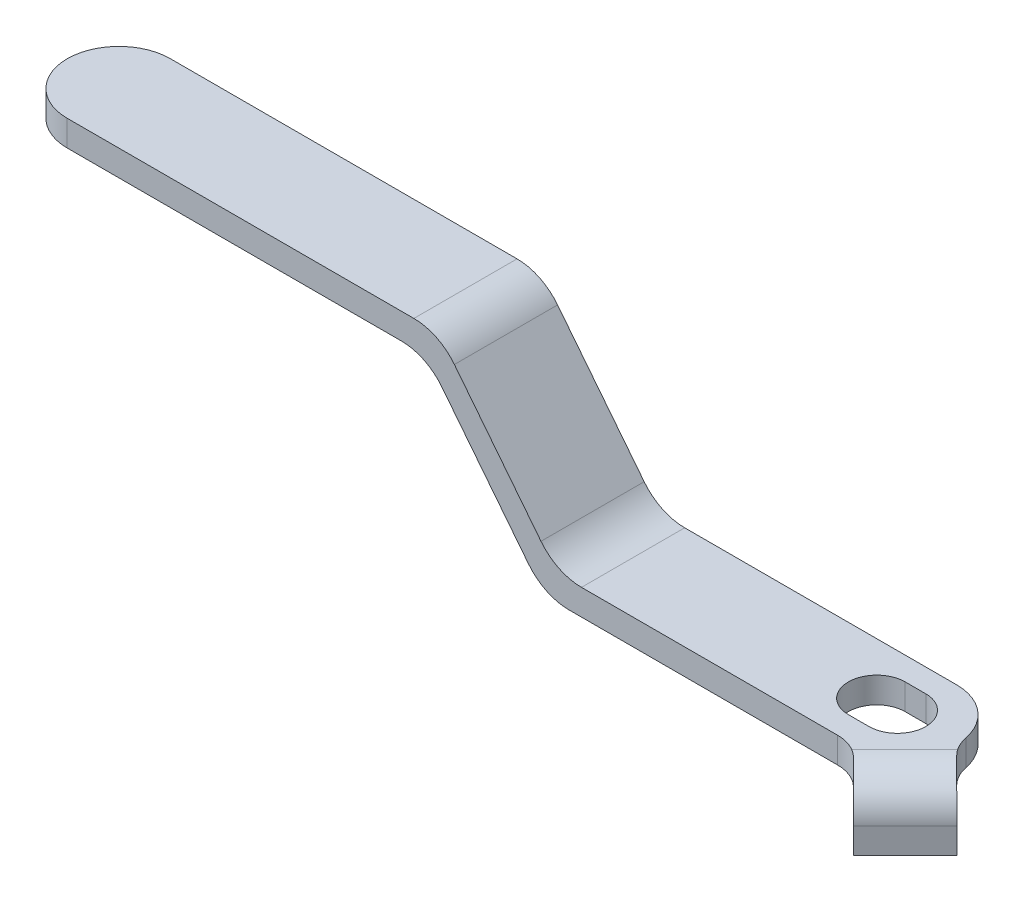
ISO-10303-21;
HEADER;
FILE_DESCRIPTION(('STEP AP214'),'2;1');
FILE_NAME('part.step','',(''),(''),'','','');
FILE_SCHEMA(('AUTOMOTIVE_DESIGN { 1 0 10303 214 1 1 1 1 }'));
ENDSEC;
DATA;
#1=APPLICATION_CONTEXT('core data for automotive mechanical design processes');
#2=APPLICATION_PROTOCOL_DEFINITION('international standard','automotive_design',2000,#1);
#3=PRODUCT_CONTEXT('',#1,'mechanical');
#4=PRODUCT('Part','Part','',(#3));
#5=PRODUCT_RELATED_PRODUCT_CATEGORY('part','',(#4));
#6=PRODUCT_DEFINITION_FORMATION('','',#4);
#7=PRODUCT_DEFINITION_CONTEXT('part definition',#1,'design');
#8=PRODUCT_DEFINITION('design','',#6,#7);
#9=PRODUCT_DEFINITION_SHAPE('','',#8);
#10=(LENGTH_UNIT() NAMED_UNIT(*) SI_UNIT(.MILLI.,.METRE.));
#11=(NAMED_UNIT(*) PLANE_ANGLE_UNIT() SI_UNIT($,.RADIAN.));
#12=(NAMED_UNIT(*) SI_UNIT($,.STERADIAN.) SOLID_ANGLE_UNIT());
#13=UNCERTAINTY_MEASURE_WITH_UNIT(LENGTH_MEASURE(1.E-05),#10,'distance_accuracy_value','');
#14=(GEOMETRIC_REPRESENTATION_CONTEXT(3) GLOBAL_UNCERTAINTY_ASSIGNED_CONTEXT((#13)) GLOBAL_UNIT_ASSIGNED_CONTEXT((#10,
#11,#12)) REPRESENTATION_CONTEXT('',''));
#15=CARTESIAN_POINT('',(0.,0.,0.));
#16=DIRECTION('',(0.,0.,1.));
#17=DIRECTION('',(1.,0.,0.));
#18=AXIS2_PLACEMENT_3D('',#15,#16,#17);
#19=CARTESIAN_POINT('',(0.,0.,10.));
#20=DIRECTION('',(0.,-1.,0.));
#21=DIRECTION('',(0.,0.,-1.));
#22=AXIS2_PLACEMENT_3D('',#19,#20,#21);
#23=PLANE('',#22);
#24=CARTESIAN_POINT('',(-15.4911035062388,0.,0.));
#25=DIRECTION('',(0.,1.,0.));
#26=DIRECTION('',(0.,0.,1.));
#27=AXIS2_PLACEMENT_3D('',#24,#25,#26);
#28=CIRCLE('',#27,5.5);
#29=CARTESIAN_POINT('',(-15.4911035062388,0.,-5.5));
#30=VERTEX_POINT('',#29);
#31=CARTESIAN_POINT('',(-15.4911035062388,0.,5.5));
#32=VERTEX_POINT('',#31);
#33=EDGE_CURVE('E248',#30,#32,#28,.T.);
#34=ORIENTED_EDGE('',*,*,#33,.T.);
#35=DIRECTION('',(1.,0.,0.));
#36=VECTOR('',#35,1.);
#37=CARTESIAN_POINT('',(-15.4911035062388,0.,5.5));
#38=LINE('',#37,#36);
#39=CARTESIAN_POINT('',(-11.4911035062388,0.,5.5));
#40=VERTEX_POINT('',#39);
#41=EDGE_CURVE('E251',#32,#40,#38,.T.);
#42=ORIENTED_EDGE('',*,*,#41,.T.);
#43=CARTESIAN_POINT('',(-11.4911035062388,0.,0.));
#44=DIRECTION('',(0.,1.,0.));
#45=DIRECTION('',(0.,0.,1.));
#46=AXIS2_PLACEMENT_3D('',#43,#44,#45);
#47=CIRCLE('',#46,5.5);
#48=CARTESIAN_POINT('',(-11.4911035062388,0.,-5.5));
#49=VERTEX_POINT('',#48);
#50=EDGE_CURVE('E255',#40,#49,#47,.T.);
#51=ORIENTED_EDGE('',*,*,#50,.T.);
#52=DIRECTION('',(-1.,0.,0.));
#53=VECTOR('',#52,1.);
#54=CARTESIAN_POINT('',(-15.4911035062388,0.,-5.5));
#55=LINE('',#54,#53);
#56=EDGE_CURVE('E258',#49,#30,#55,.T.);
#57=ORIENTED_EDGE('',*,*,#56,.T.);
#58=EDGE_LOOP('',(#34,#42,#51,#57));
#59=FACE_BOUND('',#58,.T.);
#60=CARTESIAN_POINT('',(7.15530501610128,0.,-3.45622768412761));
#61=DIRECTION('',(0.,-1.,0.));
#62=DIRECTION('',(0.,0.,-1.));
#63=AXIS2_PLACEMENT_3D('',#60,#61,#62);
#64=CIRCLE('',#63,7.5);
#65=CARTESIAN_POINT('',(-0.196968562227838,0.,-1.97498724807292));
#66=VERTEX_POINT('',#65);
#67=CARTESIAN_POINT('',(1.23971411701597,0.,1.15417189884337));
#68=VERTEX_POINT('',#67);
#69=EDGE_CURVE('E387',#66,#68,#64,.F.);
#70=ORIENTED_EDGE('',*,*,#69,.T.);
#71=DIRECTION('',(0.70616535591959,0.,-0.708046954727552));
#72=VECTOR('',#71,1.);
#73=CARTESIAN_POINT('',(-3.80139190576495,0.,6.2087101000847));
#74=LINE('',#73,#72);
#75=CARTESIAN_POINT('',(-8.88208900271876,0.,11.3029448671056));
#76=VERTEX_POINT('',#75);
#77=EDGE_CURVE('E454',#68,#76,#74,.F.);
#78=ORIENTED_EDGE('',*,*,#77,.T.);
#79=CARTESIAN_POINT('',(-13.1066017177981,0.,17.5));
#80=DIRECTION('',(0.,-1.,0.));
#81=DIRECTION('',(0.,0.,-1.));
#82=AXIS2_PLACEMENT_3D('',#79,#80,#81);
#83=CIRCLE('',#82,7.5);
#84=CARTESIAN_POINT('',(-13.1066017177981,0.,10.));
#85=VERTEX_POINT('',#84);
#86=EDGE_CURVE('E381',#76,#85,#83,.F.);
#87=ORIENTED_EDGE('',*,*,#86,.T.);
#88=DIRECTION('',(-1.,0.,0.));
#89=VECTOR('',#88,1.);
#90=CARTESIAN_POINT('',(0.,0.,10.));
#91=LINE('',#90,#89);
#92=CARTESIAN_POINT('',(-65.1506196064879,0.,10.));
#93=VERTEX_POINT('',#92);
#94=EDGE_CURVE('E290',#85,#93,#91,.T.);
#95=ORIENTED_EDGE('',*,*,#94,.T.);
#96=DIRECTION('',(0.,0.,-1.));
#97=VECTOR('',#96,1.);
#98=CARTESIAN_POINT('',(-65.1506196064879,0.,10.));
#99=LINE('',#98,#97);
#100=CARTESIAN_POINT('',(-65.1506196064879,0.,-10.));
#101=VERTEX_POINT('',#100);
#102=EDGE_CURVE('E297',#93,#101,#99,.T.);
#103=ORIENTED_EDGE('',*,*,#102,.T.);
#104=DIRECTION('',(-1.,0.,0.));
#105=VECTOR('',#104,1.);
#106=CARTESIAN_POINT('',(0.,0.,-10.));
#107=LINE('',#106,#105);
#108=CARTESIAN_POINT('',(-10.,0.,-10.));
#109=VERTEX_POINT('',#108);
#110=EDGE_CURVE('E307',#109,#101,#107,.T.);
#111=ORIENTED_EDGE('',*,*,#110,.F.);
#112=CARTESIAN_POINT('',(-10.,0.,0.));
#113=DIRECTION('',(0.,-1.,0.));
#114=DIRECTION('',(0.,0.,-1.));
#115=AXIS2_PLACEMENT_3D('',#112,#113,#114);
#116=CIRCLE('',#115,10.);
#117=EDGE_CURVE('E367',#109,#66,#116,.T.);
#118=ORIENTED_EDGE('',*,*,#117,.T.);
#119=EDGE_LOOP('',(#70,#78,#87,#95,#103,#111,#118));
#120=FACE_BOUND('',#119,.T.);
#121=ADVANCED_FACE('F41',(#59,#120),#23,.T.);
#122=CARTESIAN_POINT('',(-92.7912607189929,33.90126072,10.));
#123=DIRECTION('',(0.,-1.,0.));
#124=DIRECTION('',(1.,0.,0.));
#125=AXIS2_PLACEMENT_3D('',#122,#123,#124);
#126=PLANE('',#125);
#127=DIRECTION('',(-1.,0.,0.));
#128=VECTOR('',#127,1.);
#129=CARTESIAN_POINT('',(-92.7912607189929,33.90126072,-10.));
#130=LINE('',#129,#128);
#131=CARTESIAN_POINT('',(-95.215950915749,33.90126072,-10.));
#132=VERTEX_POINT('',#131);
#133=CARTESIAN_POINT('',(-162.41,33.90126072,-10.));
#134=VERTEX_POINT('',#133);
#135=EDGE_CURVE('E298',#132,#134,#130,.T.);
#136=ORIENTED_EDGE('',*,*,#135,.T.);
#137=CARTESIAN_POINT('',(-162.41,33.90126072,0.));
#138=DIRECTION('',(0.,-1.,0.));
#139=DIRECTION('',(1.,0.,0.));
#140=AXIS2_PLACEMENT_3D('',#137,#138,#139);
#141=CIRCLE('',#140,10.);
#142=CARTESIAN_POINT('',(-172.41,33.90126072,0.));
#143=VERTEX_POINT('',#142);
#144=EDGE_CURVE('E359',#134,#143,#141,.F.);
#145=ORIENTED_EDGE('',*,*,#144,.T.);
#146=CARTESIAN_POINT('',(-162.41,33.90126072,0.));
#147=DIRECTION('',(0.,-1.,0.));
#148=DIRECTION('',(1.,0.,0.));
#149=AXIS2_PLACEMENT_3D('',#146,#147,#148);
#150=CIRCLE('',#149,10.);
#151=CARTESIAN_POINT('',(-162.41,33.90126072,10.));
#152=VERTEX_POINT('',#151);
#153=EDGE_CURVE('E357',#143,#152,#150,.F.);
#154=ORIENTED_EDGE('',*,*,#153,.T.);
#155=DIRECTION('',(-1.,0.,0.));
#156=VECTOR('',#155,1.);
#157=CARTESIAN_POINT('',(-92.7912607189929,33.90126072,10.));
#158=LINE('',#157,#156);
#159=CARTESIAN_POINT('',(-95.215950915749,33.90126072,10.));
#160=VERTEX_POINT('',#159);
#161=EDGE_CURVE('E280',#160,#152,#158,.T.);
#162=ORIENTED_EDGE('',*,*,#161,.F.);
#163=DIRECTION('',(0.,0.,-1.));
#164=VECTOR('',#163,1.);
#165=CARTESIAN_POINT('',(-95.215950915749,33.90126072,10.));
#166=LINE('',#165,#164);
#167=EDGE_CURVE('E339',#160,#132,#166,.T.);
#168=ORIENTED_EDGE('',*,*,#167,.T.);
#169=EDGE_LOOP('',(#136,#145,#154,#162,#168));
#170=FACE_BOUND('',#169,.T.);
#171=ADVANCED_FACE('F504',(#170),#126,.F.);
#172=CARTESIAN_POINT('',(-92.7912607189929,28.90126072,10.));
#173=DIRECTION('',(0.,-1.,0.));
#174=DIRECTION('',(1.,0.,0.));
#175=AXIS2_PLACEMENT_3D('',#172,#173,#174);
#176=PLANE('',#175);
#177=CARTESIAN_POINT('',(-162.41,28.90126072,0.));
#178=DIRECTION('',(0.,-1.,0.));
#179=DIRECTION('',(1.,0.,0.));
#180=AXIS2_PLACEMENT_3D('',#177,#178,#179);
#181=CIRCLE('',#180,10.);
#182=CARTESIAN_POINT('',(-162.41,28.90126072,10.));
#183=VERTEX_POINT('',#182);
#184=CARTESIAN_POINT('',(-172.41,28.90126072,0.));
#185=VERTEX_POINT('',#184);
#186=EDGE_CURVE('E361',#183,#185,#181,.T.);
#187=ORIENTED_EDGE('',*,*,#186,.T.);
#188=CARTESIAN_POINT('',(-162.41,28.90126072,0.));
#189=DIRECTION('',(0.,-1.,0.));
#190=DIRECTION('',(1.,0.,0.));
#191=AXIS2_PLACEMENT_3D('',#188,#189,#190);
#192=CIRCLE('',#191,10.);
#193=CARTESIAN_POINT('',(-162.41,28.90126072,-10.));
#194=VERTEX_POINT('',#193);
#195=EDGE_CURVE('E363',#185,#194,#192,.T.);
#196=ORIENTED_EDGE('',*,*,#195,.T.);
#197=DIRECTION('',(-1.,0.,0.));
#198=VECTOR('',#197,1.);
#199=CARTESIAN_POINT('',(-92.7912607189929,28.90126072,-10.));
#200=LINE('',#199,#198);
#201=CARTESIAN_POINT('',(-97.6406411125051,28.90126072,-10.));
#202=VERTEX_POINT('',#201);
#203=EDGE_CURVE('E301',#202,#194,#200,.T.);
#204=ORIENTED_EDGE('',*,*,#203,.F.);
#205=DIRECTION('',(0.,0.,-1.));
#206=VECTOR('',#205,1.);
#207=CARTESIAN_POINT('',(-97.6406411125051,28.90126072,10.));
#208=LINE('',#207,#206);
#209=CARTESIAN_POINT('',(-97.6406411125051,28.90126072,10.));
#210=VERTEX_POINT('',#209);
#211=EDGE_CURVE('E337',#202,#210,#208,.F.);
#212=ORIENTED_EDGE('',*,*,#211,.T.);
#213=DIRECTION('',(-1.,0.,0.));
#214=VECTOR('',#213,1.);
#215=CARTESIAN_POINT('',(-92.7912607189929,28.90126072,10.));
#216=LINE('',#215,#214);
#217=EDGE_CURVE('E283',#210,#183,#216,.T.);
#218=ORIENTED_EDGE('',*,*,#217,.T.);
#219=EDGE_LOOP('',(#187,#196,#204,#212,#218));
#220=FACE_BOUND('',#219,.T.);
#221=ADVANCED_FACE('F495',(#220),#176,.T.);
#222=CARTESIAN_POINT('',(-70.,0.,10.));
#223=DIRECTION('',(-0.785219914461861,-0.619216994221338,0.));
#224=DIRECTION('',(0.619216994221338,-0.785219914461861,0.));
#225=AXIS2_PLACEMENT_3D('',#222,#223,#224);
#226=PLANE('',#225);
#227=DIRECTION('',(-0.619216994221338,0.785219914461861,0.));
#228=VECTOR('',#227,1.);
#229=CARTESIAN_POINT('',(-70.,0.,-10.));
#230=LINE('',#229,#228);
#231=CARTESIAN_POINT('',(-73.0028187511065,3.80783005778663,-10.));
#232=VERTEX_POINT('',#231);
#233=CARTESIAN_POINT('',(-89.7884419678865,25.0934306622134,-10.));
#234=VERTEX_POINT('',#233);
#235=EDGE_CURVE('E304',#232,#234,#230,.T.);
#236=ORIENTED_EDGE('',*,*,#235,.F.);
#237=DIRECTION('',(0.,0.,-1.));
#238=VECTOR('',#237,1.);
#239=CARTESIAN_POINT('',(-73.0028187511065,3.80783005778663,10.));
#240=LINE('',#239,#238);
#241=CARTESIAN_POINT('',(-73.0028187511065,3.80783005778663,10.));
#242=VERTEX_POINT('',#241);
#243=EDGE_CURVE('E322',#232,#242,#240,.F.);
#244=ORIENTED_EDGE('',*,*,#243,.T.);
#245=DIRECTION('',(-0.619216994221338,0.785219914461861,0.));
#246=VECTOR('',#245,1.);
#247=CARTESIAN_POINT('',(-70.,0.,10.));
#248=LINE('',#247,#246);
#249=CARTESIAN_POINT('',(-89.7884419678865,25.0934306622134,10.));
#250=VERTEX_POINT('',#249);
#251=EDGE_CURVE('E287',#242,#250,#248,.T.);
#252=ORIENTED_EDGE('',*,*,#251,.T.);
#253=DIRECTION('',(0.,0.,-1.));
#254=VECTOR('',#253,1.);
#255=CARTESIAN_POINT('',(-89.7884419678865,25.0934306622134,-10.));
#256=LINE('',#255,#254);
#257=EDGE_CURVE('E319',#250,#234,#256,.T.);
#258=ORIENTED_EDGE('',*,*,#257,.T.);
#259=EDGE_LOOP('',(#236,#244,#252,#258));
#260=FACE_BOUND('',#259,.T.);
#261=ADVANCED_FACE('F486',(#260),#226,.T.);
#262=CARTESIAN_POINT('',(0.,5.,10.));
#263=DIRECTION('',(0.,-1.,0.));
#264=DIRECTION('',(0.,0.,-1.));
#265=AXIS2_PLACEMENT_3D('',#262,#263,#264);
#266=PLANE('',#265);
#267=DIRECTION('',(1.,0.,0.));
#268=VECTOR('',#267,1.);
#269=CARTESIAN_POINT('',(-15.4911035062388,5.,5.5));
#270=LINE('',#269,#268);
#271=CARTESIAN_POINT('',(-15.4911035062388,5.,5.5));
#272=VERTEX_POINT('',#271);
#273=CARTESIAN_POINT('',(-11.4911035062388,5.,5.5));
#274=VERTEX_POINT('',#273);
#275=EDGE_CURVE('E263',#272,#274,#270,.T.);
#276=ORIENTED_EDGE('',*,*,#275,.F.);
#277=CARTESIAN_POINT('',(-15.4911035062388,5.,0.));
#278=DIRECTION('',(0.,1.,0.));
#279=DIRECTION('',(0.,0.,1.));
#280=AXIS2_PLACEMENT_3D('',#277,#278,#279);
#281=CIRCLE('',#280,5.5);
#282=CARTESIAN_POINT('',(-15.4911035062388,5.,-5.5));
#283=VERTEX_POINT('',#282);
#284=EDGE_CURVE('E246',#283,#272,#281,.T.);
#285=ORIENTED_EDGE('',*,*,#284,.F.);
#286=DIRECTION('',(-1.,0.,0.));
#287=VECTOR('',#286,1.);
#288=CARTESIAN_POINT('',(-15.4911035062388,5.,-5.5));
#289=LINE('',#288,#287);
#290=CARTESIAN_POINT('',(-11.4911035062388,5.,-5.5));
#291=VERTEX_POINT('',#290);
#292=EDGE_CURVE('E252',#291,#283,#289,.T.);
#293=ORIENTED_EDGE('',*,*,#292,.F.);
#294=CARTESIAN_POINT('',(-11.4911035062388,5.,0.));
#295=DIRECTION('',(0.,1.,0.));
#296=DIRECTION('',(0.,0.,1.));
#297=AXIS2_PLACEMENT_3D('',#294,#295,#296);
#298=CIRCLE('',#297,5.5);
#299=EDGE_CURVE('E266',#274,#291,#298,.T.);
#300=ORIENTED_EDGE('',*,*,#299,.F.);
#301=EDGE_LOOP('',(#276,#285,#293,#300));
#302=FACE_BOUND('',#301,.T.);
#303=CARTESIAN_POINT('',(-13.1066017177981,5.,17.5));
#304=DIRECTION('',(0.,-1.,0.));
#305=DIRECTION('',(0.,0.,-1.));
#306=AXIS2_PLACEMENT_3D('',#303,#304,#305);
#307=CIRCLE('',#306,7.5);
#308=CARTESIAN_POINT('',(-13.1066017177981,5.,10.));
#309=VERTEX_POINT('',#308);
#310=CARTESIAN_POINT('',(-9.31531599321688,5.,11.0288213937037));
#311=VERTEX_POINT('',#310);
#312=EDGE_CURVE('E378',#309,#311,#307,.T.);
#313=ORIENTED_EDGE('',*,*,#312,.T.);
#314=DIRECTION('',(0.707106781186547,0.,-0.707106781186548));
#315=VECTOR('',#314,1.);
#316=CARTESIAN_POINT('',(0.864948605021365,5.,0.848556795465472));
#317=LINE('',#316,#315);
#318=CARTESIAN_POINT('',(0.952972426492895,5.,0.760532973993941));
#319=VERTEX_POINT('',#318);
#320=EDGE_CURVE('E392',#311,#319,#317,.T.);
#321=ORIENTED_EDGE('',*,*,#320,.T.);
#322=CARTESIAN_POINT('',(7.15530501610128,5.,-3.45622768412761));
#323=DIRECTION('',(0.,-1.,0.));
#324=DIRECTION('',(0.,0.,-1.));
#325=AXIS2_PLACEMENT_3D('',#322,#323,#324);
#326=CIRCLE('',#325,7.5);
#327=CARTESIAN_POINT('',(-0.196968562227838,5.,-1.97498724807292));
#328=VERTEX_POINT('',#327);
#329=EDGE_CURVE('E390',#319,#328,#326,.T.);
#330=ORIENTED_EDGE('',*,*,#329,.T.);
#331=CARTESIAN_POINT('',(-10.,5.,0.));
#332=DIRECTION('',(0.,-1.,0.));
#333=DIRECTION('',(0.,0.,-1.));
#334=AXIS2_PLACEMENT_3D('',#331,#332,#333);
#335=CIRCLE('',#334,10.);
#336=CARTESIAN_POINT('',(-10.,5.,-10.));
#337=VERTEX_POINT('',#336);
#338=EDGE_CURVE('E370',#328,#337,#335,.F.);
#339=ORIENTED_EDGE('',*,*,#338,.T.);
#340=DIRECTION('',(1.,0.,0.));
#341=VECTOR('',#340,1.);
#342=CARTESIAN_POINT('',(0.,5.,-10.));
#343=LINE('',#342,#341);
#344=CARTESIAN_POINT('',(-62.7259294097318,5.,-10.));
#345=VERTEX_POINT('',#344);
#346=EDGE_CURVE('E309',#337,#345,#343,.F.);
#347=ORIENTED_EDGE('',*,*,#346,.T.);
#348=DIRECTION('',(0.,0.,-1.));
#349=VECTOR('',#348,1.);
#350=CARTESIAN_POINT('',(-62.7259294097318,5.,10.));
#351=LINE('',#350,#349);
#352=CARTESIAN_POINT('',(-62.7259294097318,5.,10.));
#353=VERTEX_POINT('',#352);
#354=EDGE_CURVE('E334',#345,#353,#351,.F.);
#355=ORIENTED_EDGE('',*,*,#354,.T.);
#356=DIRECTION('',(1.,0.,0.));
#357=VECTOR('',#356,1.);
#358=CARTESIAN_POINT('',(0.,5.,10.));
#359=LINE('',#358,#357);
#360=EDGE_CURVE('E292',#309,#353,#359,.F.);
#361=ORIENTED_EDGE('',*,*,#360,.F.);
#362=EDGE_LOOP('',(#313,#321,#330,#339,#347,#355,#361));
#363=FACE_BOUND('',#362,.T.);
#364=ADVANCED_FACE('F471',(#302,#363),#266,.F.);
#365=CARTESIAN_POINT('',(-66.0739004276907,3.09608497110669,10.));
#366=DIRECTION('',(-0.785219914461861,-0.619216994221338,0.));
#367=DIRECTION('',(0.619216994221338,-0.785219914461861,0.));
#368=AXIS2_PLACEMENT_3D('',#365,#366,#367);
#369=PLANE('',#368);
#370=DIRECTION('',(-0.619216994221338,0.785219914461861,0.));
#371=VECTOR('',#370,1.);
#372=CARTESIAN_POINT('',(-66.0739004276907,3.09608497110669,10.));
#373=LINE('',#372,#371);
#374=CARTESIAN_POINT('',(-70.5781285543504,8.80783005778662,10.));
#375=VERTEX_POINT('',#374);
#376=CARTESIAN_POINT('',(-87.3637517711304,30.0934306622134,10.));
#377=VERTEX_POINT('',#376);
#378=EDGE_CURVE('E294',#375,#377,#373,.T.);
#379=ORIENTED_EDGE('',*,*,#378,.F.);
#380=DIRECTION('',(0.,0.,-1.));
#381=VECTOR('',#380,1.);
#382=CARTESIAN_POINT('',(-70.5781285543504,8.80783005778662,-10.));
#383=LINE('',#382,#381);
#384=CARTESIAN_POINT('',(-70.5781285543504,8.80783005778662,-10.));
#385=VERTEX_POINT('',#384);
#386=EDGE_CURVE('E331',#375,#385,#383,.T.);
#387=ORIENTED_EDGE('',*,*,#386,.T.);
#388=DIRECTION('',(-0.619216994221338,0.785219914461861,0.));
#389=VECTOR('',#388,1.);
#390=CARTESIAN_POINT('',(-66.0739004276907,3.09608497110669,-10.));
#391=LINE('',#390,#389);
#392=CARTESIAN_POINT('',(-87.3637517711304,30.0934306622134,-10.));
#393=VERTEX_POINT('',#392);
#394=EDGE_CURVE('E284',#385,#393,#391,.T.);
#395=ORIENTED_EDGE('',*,*,#394,.T.);
#396=DIRECTION('',(0.,0.,-1.));
#397=VECTOR('',#396,1.);
#398=CARTESIAN_POINT('',(-87.3637517711304,30.0934306622134,10.));
#399=LINE('',#398,#397);
#400=EDGE_CURVE('E329',#393,#377,#399,.F.);
#401=ORIENTED_EDGE('',*,*,#400,.T.);
#402=EDGE_LOOP('',(#379,#387,#395,#401));
#403=FACE_BOUND('',#402,.T.);
#404=ADVANCED_FACE('F514',(#403),#369,.F.);
#405=CARTESIAN_POINT('',(0.,0.,10.));
#406=DIRECTION('',(0.,0.,-1.));
#407=DIRECTION('',(-1.,0.,0.));
#408=AXIS2_PLACEMENT_3D('',#405,#406,#407);
#409=PLANE('',#408);
#410=ORIENTED_EDGE('',*,*,#94,.F.);
#411=DIRECTION('',(0.,1.,0.));
#412=VECTOR('',#411,1.);
#413=CARTESIAN_POINT('',(-13.1066017177981,0.,10.));
#414=LINE('',#413,#412);
#415=EDGE_CURVE('E372',#85,#309,#414,.T.);
#416=ORIENTED_EDGE('',*,*,#415,.T.);
#417=ORIENTED_EDGE('',*,*,#360,.T.);
#418=CARTESIAN_POINT('',(-62.7259294097318,15.,10.));
#419=DIRECTION('',(0.,0.,-1.));
#420=DIRECTION('',(-1.,0.,0.));
#421=AXIS2_PLACEMENT_3D('',#418,#419,#420);
#422=CIRCLE('',#421,10.);
#423=EDGE_CURVE('E345',#353,#375,#422,.T.);
#424=ORIENTED_EDGE('',*,*,#423,.T.);
#425=ORIENTED_EDGE('',*,*,#378,.T.);
#426=CARTESIAN_POINT('',(-95.215950915749,23.90126072,10.));
#427=DIRECTION('',(0.,0.,-1.));
#428=DIRECTION('',(-1.,0.,0.));
#429=AXIS2_PLACEMENT_3D('',#426,#427,#428);
#430=CIRCLE('',#429,10.);
#431=EDGE_CURVE('E324',#377,#160,#430,.F.);
#432=ORIENTED_EDGE('',*,*,#431,.T.);
#433=ORIENTED_EDGE('',*,*,#161,.T.);
#434=DIRECTION('',(0.,1.,0.));
#435=VECTOR('',#434,1.);
#436=CARTESIAN_POINT('',(-162.41,28.90126072,10.));
#437=LINE('',#436,#435);
#438=EDGE_CURVE('E365',#152,#183,#437,.F.);
#439=ORIENTED_EDGE('',*,*,#438,.T.);
#440=ORIENTED_EDGE('',*,*,#217,.F.);
#441=CARTESIAN_POINT('',(-97.6406411125051,18.90126072,10.));
#442=DIRECTION('',(0.,0.,-1.));
#443=DIRECTION('',(-1.,0.,0.));
#444=AXIS2_PLACEMENT_3D('',#441,#442,#443);
#445=CIRCLE('',#444,10.);
#446=EDGE_CURVE('E349',#210,#250,#445,.T.);
#447=ORIENTED_EDGE('',*,*,#446,.T.);
#448=ORIENTED_EDGE('',*,*,#251,.F.);
#449=CARTESIAN_POINT('',(-65.1506196064879,10.,10.));
#450=DIRECTION('',(0.,0.,-1.));
#451=DIRECTION('',(-1.,0.,0.));
#452=AXIS2_PLACEMENT_3D('',#449,#450,#451);
#453=CIRCLE('',#452,10.);
#454=EDGE_CURVE('E326',#242,#93,#453,.F.);
#455=ORIENTED_EDGE('',*,*,#454,.T.);
#456=EDGE_LOOP('',(#410,#416,#417,#424,#425,#432,#433,#439,#440,#447,#448,#455));
#457=FACE_BOUND('',#456,.T.);
#458=ADVANCED_FACE('F477',(#457),#409,.F.);
#459=CARTESIAN_POINT('',(0.,0.,-10.));
#460=DIRECTION('',(0.,0.,-1.));
#461=DIRECTION('',(-1.,0.,0.));
#462=AXIS2_PLACEMENT_3D('',#459,#460,#461);
#463=PLANE('',#462);
#464=ORIENTED_EDGE('',*,*,#203,.T.);
#465=DIRECTION('',(0.,1.,0.));
#466=VECTOR('',#465,1.);
#467=CARTESIAN_POINT('',(-162.41,0.,-10.));
#468=LINE('',#467,#466);
#469=EDGE_CURVE('E354',#194,#134,#468,.T.);
#470=ORIENTED_EDGE('',*,*,#469,.T.);
#471=ORIENTED_EDGE('',*,*,#135,.F.);
#472=CARTESIAN_POINT('',(-95.215950915749,23.90126072,-10.));
#473=DIRECTION('',(0.,0.,-1.));
#474=DIRECTION('',(-1.,0.,0.));
#475=AXIS2_PLACEMENT_3D('',#472,#473,#474);
#476=CIRCLE('',#475,10.);
#477=EDGE_CURVE('E315',#132,#393,#476,.T.);
#478=ORIENTED_EDGE('',*,*,#477,.T.);
#479=ORIENTED_EDGE('',*,*,#394,.F.);
#480=CARTESIAN_POINT('',(-62.7259294097318,15.,-10.));
#481=DIRECTION('',(0.,0.,-1.));
#482=DIRECTION('',(-1.,0.,0.));
#483=AXIS2_PLACEMENT_3D('',#480,#481,#482);
#484=CIRCLE('',#483,10.);
#485=EDGE_CURVE('E342',#385,#345,#484,.F.);
#486=ORIENTED_EDGE('',*,*,#485,.T.);
#487=ORIENTED_EDGE('',*,*,#346,.F.);
#488=DIRECTION('',(0.,-1.,0.));
#489=VECTOR('',#488,1.);
#490=CARTESIAN_POINT('',(-10.,0.,-10.));
#491=LINE('',#490,#489);
#492=EDGE_CURVE('E351',#337,#109,#491,.T.);
#493=ORIENTED_EDGE('',*,*,#492,.T.);
#494=ORIENTED_EDGE('',*,*,#110,.T.);
#495=CARTESIAN_POINT('',(-65.1506196064879,10.,-10.));
#496=DIRECTION('',(0.,0.,-1.));
#497=DIRECTION('',(-1.,0.,0.));
#498=AXIS2_PLACEMENT_3D('',#495,#496,#497);
#499=CIRCLE('',#498,10.);
#500=EDGE_CURVE('E317',#101,#232,#499,.T.);
#501=ORIENTED_EDGE('',*,*,#500,.T.);
#502=ORIENTED_EDGE('',*,*,#235,.T.);
#503=CARTESIAN_POINT('',(-97.6406411125051,18.90126072,-10.));
#504=DIRECTION('',(0.,0.,-1.));
#505=DIRECTION('',(-1.,0.,0.));
#506=AXIS2_PLACEMENT_3D('',#503,#504,#505);
#507=CIRCLE('',#506,10.);
#508=EDGE_CURVE('E347',#234,#202,#507,.F.);
#509=ORIENTED_EDGE('',*,*,#508,.T.);
#510=EDGE_LOOP('',(#464,#470,#471,#478,#479,#486,#487,#493,#494,#501,#502,#509));
#511=FACE_BOUND('',#510,.T.);
#512=ADVANCED_FACE('F466',(#511),#463,.T.);
#513=CARTESIAN_POINT('',(-65.1506196064879,10.,10.));
#514=DIRECTION('',(0.,0.,-1.));
#515=DIRECTION('',(-1.,0.,0.));
#516=AXIS2_PLACEMENT_3D('',#513,#514,#515);
#517=CYLINDRICAL_SURFACE('',#516,10.);
#518=ORIENTED_EDGE('',*,*,#454,.F.);
#519=ORIENTED_EDGE('',*,*,#243,.F.);
#520=ORIENTED_EDGE('',*,*,#500,.F.);
#521=ORIENTED_EDGE('',*,*,#102,.F.);
#522=EDGE_LOOP('',(#518,#519,#520,#521));
#523=FACE_BOUND('',#522,.T.);
#524=ADVANCED_FACE('F482',(#523),#517,.T.);
#525=CARTESIAN_POINT('',(-62.7259294097318,15.,10.));
#526=DIRECTION('',(0.,0.,1.));
#527=DIRECTION('',(1.,0.,0.));
#528=AXIS2_PLACEMENT_3D('',#525,#526,#527);
#529=CYLINDRICAL_SURFACE('',#528,10.);
#530=ORIENTED_EDGE('',*,*,#423,.F.);
#531=ORIENTED_EDGE('',*,*,#354,.F.);
#532=ORIENTED_EDGE('',*,*,#485,.F.);
#533=ORIENTED_EDGE('',*,*,#386,.F.);
#534=EDGE_LOOP('',(#530,#531,#532,#533));
#535=FACE_BOUND('',#534,.T.);
#536=ADVANCED_FACE('F517',(#535),#529,.F.);
#537=CARTESIAN_POINT('',(-97.6406411125051,18.90126072,10.));
#538=DIRECTION('',(0.,0.,1.));
#539=DIRECTION('',(1.,0.,0.));
#540=AXIS2_PLACEMENT_3D('',#537,#538,#539);
#541=CYLINDRICAL_SURFACE('',#540,10.);
#542=ORIENTED_EDGE('',*,*,#446,.F.);
#543=ORIENTED_EDGE('',*,*,#211,.F.);
#544=ORIENTED_EDGE('',*,*,#508,.F.);
#545=ORIENTED_EDGE('',*,*,#257,.F.);
#546=EDGE_LOOP('',(#542,#543,#544,#545));
#547=FACE_BOUND('',#546,.T.);
#548=ADVANCED_FACE('F490',(#547),#541,.F.);
#549=CARTESIAN_POINT('',(-95.215950915749,23.90126072,10.));
#550=DIRECTION('',(0.,0.,-1.));
#551=DIRECTION('',(-1.,0.,0.));
#552=AXIS2_PLACEMENT_3D('',#549,#550,#551);
#553=CYLINDRICAL_SURFACE('',#552,10.);
#554=ORIENTED_EDGE('',*,*,#431,.F.);
#555=ORIENTED_EDGE('',*,*,#400,.F.);
#556=ORIENTED_EDGE('',*,*,#477,.F.);
#557=ORIENTED_EDGE('',*,*,#167,.F.);
#558=EDGE_LOOP('',(#554,#555,#556,#557));
#559=FACE_BOUND('',#558,.T.);
#560=ADVANCED_FACE('F510',(#559),#553,.T.);
#561=CARTESIAN_POINT('',(-162.41,28.90126072,0.));
#562=DIRECTION('',(0.,-1.,0.));
#563=DIRECTION('',(0.,0.,-1.));
#564=AXIS2_PLACEMENT_3D('',#561,#562,#563);
#565=CYLINDRICAL_SURFACE('',#564,10.);
#566=DIRECTION('',(0.,1.,0.));
#567=VECTOR('',#566,1.);
#568=CARTESIAN_POINT('',(-172.41,33.90126072,0.));
#569=LINE('',#568,#567);
#570=EDGE_CURVE('E273',#185,#143,#569,.T.);
#571=ORIENTED_EDGE('',*,*,#570,.F.);
#572=ORIENTED_EDGE('',*,*,#186,.F.);
#573=ORIENTED_EDGE('',*,*,#438,.F.);
#574=ORIENTED_EDGE('',*,*,#153,.F.);
#575=EDGE_LOOP('',(#571,#572,#573,#574));
#576=FACE_BOUND('',#575,.T.);
#577=ADVANCED_FACE('F520',(#576),#565,.T.);
#578=CARTESIAN_POINT('',(-162.41,0.,0.));
#579=DIRECTION('',(0.,1.,0.));
#580=DIRECTION('',(0.,0.,1.));
#581=AXIS2_PLACEMENT_3D('',#578,#579,#580);
#582=CYLINDRICAL_SURFACE('',#581,10.);
#583=ORIENTED_EDGE('',*,*,#195,.F.);
#584=ORIENTED_EDGE('',*,*,#570,.T.);
#585=ORIENTED_EDGE('',*,*,#144,.F.);
#586=ORIENTED_EDGE('',*,*,#469,.F.);
#587=EDGE_LOOP('',(#583,#584,#585,#586));
#588=FACE_BOUND('',#587,.T.);
#589=ADVANCED_FACE('F501',(#588),#582,.T.);
#590=CARTESIAN_POINT('',(-10.,0.,0.));
#591=DIRECTION('',(0.,-1.,0.));
#592=DIRECTION('',(0.,0.,-1.));
#593=AXIS2_PLACEMENT_3D('',#590,#591,#592);
#594=CYLINDRICAL_SURFACE('',#593,10.);
#595=ORIENTED_EDGE('',*,*,#338,.F.);
#596=DIRECTION('',(0.,-1.,0.));
#597=VECTOR('',#596,1.);
#598=CARTESIAN_POINT('',(-0.196968562227838,0.,-1.97498724807292));
#599=LINE('',#598,#597);
#600=EDGE_CURVE('E383',#328,#66,#599,.T.);
#601=ORIENTED_EDGE('',*,*,#600,.T.);
#602=ORIENTED_EDGE('',*,*,#117,.F.);
#603=ORIENTED_EDGE('',*,*,#492,.F.);
#604=EDGE_LOOP('',(#595,#601,#602,#603));
#605=FACE_BOUND('',#604,.T.);
#606=ADVANCED_FACE('F463',(#605),#594,.T.);
#607=CARTESIAN_POINT('',(-15.4911035062388,0.,0.));
#608=DIRECTION('',(0.,1.,0.));
#609=DIRECTION('',(0.,0.,1.));
#610=AXIS2_PLACEMENT_3D('',#607,#608,#609);
#611=CYLINDRICAL_SURFACE('',#610,5.5);
#612=ORIENTED_EDGE('',*,*,#284,.T.);
#613=DIRECTION('',(0.,1.,0.));
#614=VECTOR('',#613,1.);
#615=CARTESIAN_POINT('',(-15.4911035062388,0.,5.5));
#616=LINE('',#615,#614);
#617=EDGE_CURVE('E261',#32,#272,#616,.T.);
#618=ORIENTED_EDGE('',*,*,#617,.F.);
#619=ORIENTED_EDGE('',*,*,#33,.F.);
#620=DIRECTION('',(0.,1.,0.));
#621=VECTOR('',#620,1.);
#622=CARTESIAN_POINT('',(-15.4911035062388,0.,-5.5));
#623=LINE('',#622,#621);
#624=EDGE_CURVE('E271',#30,#283,#623,.T.);
#625=ORIENTED_EDGE('',*,*,#624,.T.);
#626=EDGE_LOOP('',(#612,#618,#619,#625));
#627=FACE_BOUND('',#626,.T.);
#628=ADVANCED_FACE('F614',(#627),#611,.F.);
#629=CARTESIAN_POINT('',(-15.4911035062388,0.,-5.5));
#630=DIRECTION('',(0.,0.,-1.));
#631=DIRECTION('',(-1.,0.,0.));
#632=AXIS2_PLACEMENT_3D('',#629,#630,#631);
#633=PLANE('',#632);
#634=ORIENTED_EDGE('',*,*,#292,.T.);
#635=ORIENTED_EDGE('',*,*,#624,.F.);
#636=ORIENTED_EDGE('',*,*,#56,.F.);
#637=DIRECTION('',(0.,1.,0.));
#638=VECTOR('',#637,1.);
#639=CARTESIAN_POINT('',(-11.4911035062388,0.,-5.5));
#640=LINE('',#639,#638);
#641=EDGE_CURVE('E274',#49,#291,#640,.T.);
#642=ORIENTED_EDGE('',*,*,#641,.T.);
#643=EDGE_LOOP('',(#634,#635,#636,#642));
#644=FACE_BOUND('',#643,.T.);
#645=ADVANCED_FACE('F621',(#644),#633,.F.);
#646=CARTESIAN_POINT('',(-11.4911035062388,0.,0.));
#647=DIRECTION('',(0.,1.,0.));
#648=DIRECTION('',(0.,0.,1.));
#649=AXIS2_PLACEMENT_3D('',#646,#647,#648);
#650=CYLINDRICAL_SURFACE('',#649,5.5);
#651=ORIENTED_EDGE('',*,*,#299,.T.);
#652=ORIENTED_EDGE('',*,*,#641,.F.);
#653=ORIENTED_EDGE('',*,*,#50,.F.);
#654=DIRECTION('',(0.,1.,0.));
#655=VECTOR('',#654,1.);
#656=CARTESIAN_POINT('',(-11.4911035062388,0.,5.5));
#657=LINE('',#656,#655);
#658=EDGE_CURVE('E276',#40,#274,#657,.T.);
#659=ORIENTED_EDGE('',*,*,#658,.T.);
#660=EDGE_LOOP('',(#651,#652,#653,#659));
#661=FACE_BOUND('',#660,.T.);
#662=ADVANCED_FACE('F630',(#661),#650,.F.);
#663=CARTESIAN_POINT('',(-15.4911035062388,0.,5.5));
#664=DIRECTION('',(0.,0.,1.));
#665=DIRECTION('',(1.,0.,0.));
#666=AXIS2_PLACEMENT_3D('',#663,#664,#665);
#667=PLANE('',#666);
#668=ORIENTED_EDGE('',*,*,#275,.T.);
#669=ORIENTED_EDGE('',*,*,#658,.F.);
#670=ORIENTED_EDGE('',*,*,#41,.F.);
#671=ORIENTED_EDGE('',*,*,#617,.T.);
#672=EDGE_LOOP('',(#668,#669,#670,#671));
#673=FACE_BOUND('',#672,.T.);
#674=ADVANCED_FACE('F639',(#673),#667,.F.);
#675=CARTESIAN_POINT('',(6.16824946392047,0.,6.15185765436458));
#676=DIRECTION('',(0.706165355919589,0.,-0.708046954727552));
#677=DIRECTION('',(-0.708046954727552,0.,-0.706165355919589));
#678=AXIS2_PLACEMENT_3D('',#675,#676,#677);
#679=PLANE('',#678);
#680=DIRECTION('',(0.,1.,0.));
#681=VECTOR('',#680,1.);
#682=CARTESIAN_POINT('',(1.85906484670436,5.,1.85412447632903));
#683=LINE('',#682,#681);
#684=CARTESIAN_POINT('',(1.85906484670436,-0.230858284732132,1.85412447632903));
#685=VERTEX_POINT('',#684);
#686=CARTESIAN_POINT('',(1.85906484670436,4.86550284128344,1.85412447632903));
#687=VERTEX_POINT('',#686);
#688=EDGE_CURVE('E64',#685,#687,#683,.T.);
#689=ORIENTED_EDGE('',*,*,#688,.T.);
#690=CARTESIAN_POINT('',(0.857892603246213,-2.5,0.855612797240624));
#691=DIRECTION('',(0.706165355919589,0.,-0.708046954727552));
#692=DIRECTION('',(-0.708046954727552,0.,-0.706165355919589));
#693=AXIS2_PLACEMENT_3D('',#690,#691,#692);
#694=ELLIPSE('',#693,7.5000066382852,7.5);
#695=CARTESIAN_POINT('',(6.16824946392047,-2.5,6.15185765436458));
#696=VERTEX_POINT('',#695);
#697=EDGE_CURVE('E402',#687,#696,#694,.T.);
#698=ORIENTED_EDGE('',*,*,#697,.T.);
#699=DIRECTION('',(0.,1.,0.));
#700=VECTOR('',#699,1.);
#701=CARTESIAN_POINT('',(6.16824946392047,0.,6.15185765436458));
#702=LINE('',#701,#700);
#703=CARTESIAN_POINT('',(6.16824946392047,-7.5,6.15185765436458));
#704=VERTEX_POINT('',#703);
#705=EDGE_CURVE('E223',#704,#696,#702,.T.);
#706=ORIENTED_EDGE('',*,*,#705,.F.);
#707=DIRECTION('',(0.708046954727552,0.,0.70616535591959));
#708=VECTOR('',#707,1.);
#709=CARTESIAN_POINT('',(2.61468430161978,-7.5,2.60773591093429));
#710=LINE('',#709,#708);
#711=CARTESIAN_POINT('',(2.61468430161978,-7.5,2.60773591093429));
#712=VERTEX_POINT('',#711);
#713=EDGE_CURVE('E237',#712,#704,#710,.T.);
#714=ORIENTED_EDGE('',*,*,#713,.F.);
#715=DIRECTION('',(0.,1.,0.));
#716=VECTOR('',#715,1.);
#717=CARTESIAN_POINT('',(2.61468430161978,-7.5,2.60773591093429));
#718=LINE('',#717,#716);
#719=CARTESIAN_POINT('',(2.61468430161978,-2.,2.60773591093429));
#720=VERTEX_POINT('',#719);
#721=EDGE_CURVE('E242',#712,#720,#718,.T.);
#722=ORIENTED_EDGE('',*,*,#721,.T.);
#723=CARTESIAN_POINT('',(1.19859039216468,-2.,1.19540519909511));
#724=DIRECTION('',(0.706165355919589,0.,-0.708046954727552));
#725=DIRECTION('',(-0.708046954727552,0.,-0.706165355919589));
#726=AXIS2_PLACEMENT_3D('',#723,#724,#725);
#727=CIRCLE('',#726,2.);
#728=EDGE_CURVE('E421',#720,#685,#727,.F.);
#729=ORIENTED_EDGE('',*,*,#728,.T.);
#730=EDGE_LOOP('',(#689,#698,#706,#714,#722,#729));
#731=FACE_BOUND('',#730,.T.);
#732=ADVANCED_FACE('F442',(#731),#679,.T.);
#733=CARTESIAN_POINT('',(-3.83994644085742,0.,16.1600535591425));
#734=DIRECTION('',(0.707106781186548,0.,0.707106781186547));
#735=DIRECTION('',(0.707106781186547,0.,-0.707106781186548));
#736=AXIS2_PLACEMENT_3D('',#733,#734,#735);
#737=PLANE('',#736);
#738=ORIENTED_EDGE('',*,*,#705,.T.);
#739=DIRECTION('',(0.707106781186547,0.,-0.707106781186548));
#740=VECTOR('',#739,1.);
#741=CARTESIAN_POINT('',(-3.83994644085742,-2.5,16.1600535591425));
#742=LINE('',#741,#740);
#743=CARTESIAN_POINT('',(-3.83994644085742,-2.5,16.1600535591425));
#744=VERTEX_POINT('',#743);
#745=EDGE_CURVE('E221',#696,#744,#742,.F.);
#746=ORIENTED_EDGE('',*,*,#745,.T.);
#747=DIRECTION('',(0.,1.,0.));
#748=VECTOR('',#747,1.);
#749=CARTESIAN_POINT('',(-3.83994644085742,0.,16.1600535591425));
#750=LINE('',#749,#748);
#751=CARTESIAN_POINT('',(-3.83994644085742,-7.5,16.1600535591425));
#752=VERTEX_POINT('',#751);
#753=EDGE_CURVE('E214',#752,#744,#750,.T.);
#754=ORIENTED_EDGE('',*,*,#753,.F.);
#755=DIRECTION('',(-0.707106781186547,0.,0.707106781186548));
#756=VECTOR('',#755,1.);
#757=CARTESIAN_POINT('',(6.16824946392047,-7.5,6.15185765436458));
#758=LINE('',#757,#756);
#759=EDGE_CURVE('E219',#704,#752,#758,.T.);
#760=ORIENTED_EDGE('',*,*,#759,.F.);
#761=EDGE_LOOP('',(#738,#746,#754,#760));
#762=FACE_BOUND('',#761,.T.);
#763=ADVANCED_FACE('F217',(#762),#737,.T.);
#764=CARTESIAN_POINT('',(-9.9999999999999,0.,10.));
#765=DIRECTION('',(-0.707106781186548,0.,0.707106781186547));
#766=DIRECTION('',(0.707106781186547,0.,0.707106781186548));
#767=AXIS2_PLACEMENT_3D('',#764,#765,#766);
#768=PLANE('',#767);
#769=ORIENTED_EDGE('',*,*,#753,.T.);
#770=CARTESIAN_POINT('',(-9.14324729975653,-2.5,10.8567527002434));
#771=DIRECTION('',(-0.707106781186548,0.,0.707106781186547));
#772=DIRECTION('',(0.707106781186547,0.,0.707106781186548));
#773=AXIS2_PLACEMENT_3D('',#770,#771,#772);
#774=CIRCLE('',#773,7.5);
#775=CARTESIAN_POINT('',(-7.803300858899,4.75665812004855,12.1966991411009));
#776=VERTEX_POINT('',#775);
#777=EDGE_CURVE('E445',#744,#776,#774,.T.);
#778=ORIENTED_EDGE('',*,*,#777,.T.);
#779=DIRECTION('',(0.,1.,0.));
#780=VECTOR('',#779,1.);
#781=CARTESIAN_POINT('',(-7.803300858899,0.,12.1966991411009));
#782=LINE('',#781,#780);
#783=CARTESIAN_POINT('',(-7.803300858899,-0.566802174601156,12.1966991411009));
#784=VERTEX_POINT('',#783);
#785=EDGE_CURVE('E56',#776,#784,#782,.F.);
#786=ORIENTED_EDGE('',*,*,#785,.T.);
#787=CARTESIAN_POINT('',(-8.78969516089032,-2.,11.2103048391096));
#788=DIRECTION('',(-0.707106781186548,0.,0.707106781186547));
#789=DIRECTION('',(-0.707106781186547,0.,-0.707106781186548));
#790=AXIS2_PLACEMENT_3D('',#787,#788,#789);
#791=ELLIPSE('',#790,2.00000177020939,2.);
#792=CARTESIAN_POINT('',(-7.37548034679016,-2.,12.6245196532097));
#793=VERTEX_POINT('',#792);
#794=EDGE_CURVE('E11',#784,#793,#791,.F.);
#795=ORIENTED_EDGE('',*,*,#794,.T.);
#796=DIRECTION('',(0.,1.,0.));
#797=VECTOR('',#796,1.);
#798=CARTESIAN_POINT('',(-7.37548034679016,-7.5,12.6245196532097));
#799=LINE('',#798,#797);
#800=CARTESIAN_POINT('',(-7.37548034679016,-7.5,12.6245196532097));
#801=VERTEX_POINT('',#800);
#802=EDGE_CURVE('E224',#801,#793,#799,.T.);
#803=ORIENTED_EDGE('',*,*,#802,.F.);
#804=DIRECTION('',(-0.707106781186548,0.,-0.707106781186548));
#805=VECTOR('',#804,1.);
#806=CARTESIAN_POINT('',(-3.83994644085742,-7.5,16.1600535591425));
#807=LINE('',#806,#805);
#808=EDGE_CURVE('E227',#752,#801,#807,.T.);
#809=ORIENTED_EDGE('',*,*,#808,.F.);
#810=EDGE_LOOP('',(#769,#778,#786,#795,#803,#809));
#811=FACE_BOUND('',#810,.T.);
#812=ADVANCED_FACE('F228',(#811),#768,.T.);
#813=CARTESIAN_POINT('',(-7.37548034679016,-7.5,12.6245196532097));
#814=DIRECTION('',(0.708046954727552,0.,0.70616535591959));
#815=DIRECTION('',(0.70616535591959,0.,-0.708046954727552));
#816=AXIS2_PLACEMENT_3D('',#813,#814,#815);
#817=PLANE('',#816);
#818=ORIENTED_EDGE('',*,*,#802,.T.);
#819=DIRECTION('',(0.70616535591959,0.,-0.708046954727552));
#820=VECTOR('',#819,1.);
#821=CARTESIAN_POINT('',(-7.37548034679016,-2.,12.6245196532097));
#822=LINE('',#821,#820);
#823=EDGE_CURVE('E437',#793,#720,#822,.T.);
#824=ORIENTED_EDGE('',*,*,#823,.T.);
#825=ORIENTED_EDGE('',*,*,#721,.F.);
#826=DIRECTION('',(0.70616535591959,0.,-0.708046954727552));
#827=VECTOR('',#826,1.);
#828=CARTESIAN_POINT('',(-7.37548034679016,-7.5,12.6245196532097));
#829=LINE('',#828,#827);
#830=EDGE_CURVE('E232',#801,#712,#829,.T.);
#831=ORIENTED_EDGE('',*,*,#830,.F.);
#832=EDGE_LOOP('',(#818,#824,#825,#831));
#833=FACE_BOUND('',#832,.T.);
#834=ADVANCED_FACE('F439',(#833),#817,.F.);
#835=CARTESIAN_POINT('',(0.,-7.5,0.));
#836=DIRECTION('',(0.,-1.,0.));
#837=DIRECTION('',(0.,0.,-1.));
#838=AXIS2_PLACEMENT_3D('',#835,#836,#837);
#839=PLANE('',#838);
#840=ORIENTED_EDGE('',*,*,#759,.T.);
#841=ORIENTED_EDGE('',*,*,#808,.T.);
#842=ORIENTED_EDGE('',*,*,#830,.T.);
#843=ORIENTED_EDGE('',*,*,#713,.T.);
#844=EDGE_LOOP('',(#840,#841,#842,#843));
#845=FACE_BOUND('',#844,.T.);
#846=ADVANCED_FACE('F235',(#845),#839,.T.);
#847=CARTESIAN_POINT('',(-13.1066017177981,0.,17.5));
#848=DIRECTION('',(0.,1.,0.));
#849=DIRECTION('',(0.,0.,1.));
#850=AXIS2_PLACEMENT_3D('',#847,#848,#849);
#851=CYLINDRICAL_SURFACE('',#850,7.5);
#852=ORIENTED_EDGE('',*,*,#785,.F.);
#853=CARTESIAN_POINT('',(-7.803300858899,4.75665812004855,12.1966991411009));
#854=CARTESIAN_POINT('',(-7.91411518334172,4.79762872627544,12.0858349033151));
#855=CARTESIAN_POINT('',(-8.02941454836184,4.83345307799645,11.9775354818784));
#856=CARTESIAN_POINT('',(-8.26722862814009,4.89448077726211,11.7680504329506));
#857=CARTESIAN_POINT('',(-8.38967765727442,4.91976744669731,11.6668144803519));
#858=CARTESIAN_POINT('',(-8.64184955270654,4.96005402640066,11.4716164123178));
#859=CARTESIAN_POINT('',(-8.77157241900434,4.97505393666881,11.3776542968826));
#860=CARTESIAN_POINT('',(-9.0383750833483,4.99508558648763,11.1971578325205));
#861=CARTESIAN_POINT('',(-9.17550611861025,5.00003529406338,11.1106900813256));
#862=CARTESIAN_POINT('',(-9.31531599321688,5.,11.0288213937037));
#863=B_SPLINE_CURVE_WITH_KNOTS('',3,(#853,#854,#855,#856,#857,#858,#859,#860,#861,#862),
.UNSPECIFIED.,.F.,.F.,(4,2,2,2,4),(0.,0.485904855138295,0.967891194404099,1.4498775336699,
1.9357823888082),.UNSPECIFIED.);
#864=EDGE_CURVE('E446',#776,#311,#863,.T.);
#865=ORIENTED_EDGE('',*,*,#864,.T.);
#866=ORIENTED_EDGE('',*,*,#312,.F.);
#867=ORIENTED_EDGE('',*,*,#415,.F.);
#868=ORIENTED_EDGE('',*,*,#86,.F.);
#869=CARTESIAN_POINT('',(-8.88208900271876,0.,11.3029448671056));
#870=CARTESIAN_POINT('',(-8.83659460378339,6.18682904436314E-06,11.3339514872199));
#871=CARTESIAN_POINT('',(-8.79144677546933,-0.00219577475017535,11.3654689317776));
#872=CARTESIAN_POINT('',(-8.70213596579397,-0.0110258057474565,11.4292774885884));
#873=CARTESIAN_POINT('',(-8.65797307224983,-0.0176542682166414,11.4615686692999));
#874=CARTESIAN_POINT('',(-8.57092052440136,-0.035349453877815,11.5266797215434));
#875=CARTESIAN_POINT('',(-8.52803120959241,-0.0464173492740782,11.5594997305105));
#876=CARTESIAN_POINT('',(-8.44382860664917,-0.0729385827680345,11.6253587930556));
#877=CARTESIAN_POINT('',(-8.40251518352147,-0.0883915442725412,11.6583978275855));
#878=CARTESIAN_POINT('',(-8.28122708027521,-0.1412670088977,11.7574728061869));
#879=CARTESIAN_POINT('',(-8.20393327070855,-0.185200254708722,11.8234450262895));
#880=CARTESIAN_POINT('',(-8.05850546920889,-0.289189795767082,11.9523720677808));
#881=CARTESIAN_POINT('',(-7.99035456645942,-0.349215691347292,12.0153323173239));
#882=CARTESIAN_POINT('',(-7.90540683572444,-0.439779073422186,12.096436322332));
#883=CARTESIAN_POINT('',(-7.8840818163357,-0.464047289899976,12.1170522330055));
#884=CARTESIAN_POINT('',(-7.84272636434852,-0.514213912067258,12.157486723672));
#885=CARTESIAN_POINT('',(-7.82269420325026,-0.540110045791573,12.1773063542819));
#886=CARTESIAN_POINT('',(-7.80330085889899,-0.566802174601151,12.1966991411009));
#887=B_SPLINE_CURVE_WITH_KNOTS('',3,(#869,#870,#871,#872,#873,#874,#875,#876,#877,#878,#879,
#880,#881,#882,#883,#884,#885,#886),.UNSPECIFIED.,.F.,.F.,(4,2,2,2,2,2,2,2,4),(0.,
0.165121340614986,0.330257345128435,0.495436981496204,0.66060243638809,0.991041113924373,
1.32085992484089,1.43578254383358,1.55054818914451),.UNSPECIFIED.);
#888=EDGE_CURVE('E50',#76,#784,#887,.T.);
#889=ORIENTED_EDGE('',*,*,#888,.T.);
#890=EDGE_LOOP('',(#852,#865,#866,#867,#868,#889));
#891=FACE_BOUND('',#890,.T.);
#892=ADVANCED_FACE('F410',(#891),#851,.F.);
#893=CARTESIAN_POINT('',(7.15530501610128,0.,-3.45622768412761));
#894=DIRECTION('',(0.,-1.,0.));
#895=DIRECTION('',(0.,0.,-1.));
#896=AXIS2_PLACEMENT_3D('',#893,#894,#895);
#897=CYLINDRICAL_SURFACE('',#896,7.5);
#898=ORIENTED_EDGE('',*,*,#329,.F.);
#899=CARTESIAN_POINT('',(0.952972426492897,5.,0.760532973993941));
#900=CARTESIAN_POINT('',(1.02015091986295,5.00001064882276,0.859363436125565));
#901=CARTESIAN_POINT('',(1.08971088030813,4.99724405668048,0.956578461739585));
#902=CARTESIAN_POINT('',(1.232902607298,4.98610905569294,1.14694861750013));
#903=CARTESIAN_POINT('',(1.30651479246893,4.97776573089468,1.24011994649725));
#904=CARTESIAN_POINT('',(1.45772681683887,4.95543120224907,1.42246391455508));
#905=CARTESIAN_POINT('',(1.53532665518638,4.94143999960774,1.51163655446965));
#906=CARTESIAN_POINT('',(1.69443730168403,4.90775859992752,1.68604412426855));
#907=CARTESIAN_POINT('',(1.7759640993536,4.8880431074168,1.77125958541397));
#908=CARTESIAN_POINT('',(1.85906484670436,4.86550284128344,1.85412447632903));
#909=B_SPLINE_CURVE_WITH_KNOTS('',3,(#899,#900,#901,#902,#903,#904,#905,#906,#907,#908),
.UNSPECIFIED.,.F.,.F.,(4,2,2,2,4),(0.,0.358439555689962,0.715277609788015,1.0721155876882,
1.43055506709562),.UNSPECIFIED.);
#910=EDGE_CURVE('E395',#319,#687,#909,.T.);
#911=ORIENTED_EDGE('',*,*,#910,.T.);
#912=ORIENTED_EDGE('',*,*,#688,.F.);
#913=CARTESIAN_POINT('',(1.85906484670436,-0.230858284732132,1.85412447632903));
#914=CARTESIAN_POINT('',(1.8244403804791,-0.205068496672533,1.81959843269149));
#915=CARTESIAN_POINT('',(1.78939741447328,-0.181317809918816,1.78396714796969));
#916=CARTESIAN_POINT('',(1.71879655304041,-0.138030007899206,1.71068117088964));
#917=CARTESIAN_POINT('',(1.68323847240451,-0.118494450427476,1.67302573686245));
#918=CARTESIAN_POINT('',(1.61269069687389,-0.0841494385757924,1.59669972624397));
#919=CARTESIAN_POINT('',(1.57770440751574,-0.0692508080109941,1.55806611215009));
#920=CARTESIAN_POINT('',(1.50789062259818,-0.0437389328305109,1.479304558466));
#921=CARTESIAN_POINT('',(1.47306305931121,-0.0331236494058262,1.43917733976735));
#922=CARTESIAN_POINT('',(1.40492906850648,-0.0164917562041483,1.35894147587121));
#923=CARTESIAN_POINT('',(1.37160924126256,-0.0103410649582464,1.31887190638413));
#924=CARTESIAN_POINT('',(1.30527650011142,-0.00207141712652834,1.23738223629451));
#925=CARTESIAN_POINT('',(1.27227017281492,5.82010547798467E-06,1.19595253479275));
#926=CARTESIAN_POINT('',(1.23971411701596,0.,1.15417189884338));
#927=B_SPLINE_CURVE_WITH_KNOTS('',3,(#913,#914,#915,#916,#917,#918,#919,#920,#921,#922,#923,
#924,#925,#926),.UNSPECIFIED.,.F.,.F.,(4,2,2,2,2,2,4),(0.,0.165796250480642,0.331653670074154,
0.494089833969015,0.656448589221696,0.813703111609342,0.972559955967485),.UNSPECIFIED.);
#928=EDGE_CURVE('E415',#685,#68,#927,.T.);
#929=ORIENTED_EDGE('',*,*,#928,.T.);
#930=ORIENTED_EDGE('',*,*,#69,.F.);
#931=ORIENTED_EDGE('',*,*,#600,.F.);
#932=EDGE_LOOP('',(#898,#911,#912,#929,#930,#931));
#933=FACE_BOUND('',#932,.T.);
#934=ADVANCED_FACE('F406',(#933),#897,.F.);
#935=CARTESIAN_POINT('',(-4.14324729975658,-2.5,5.85675270024342));
#936=DIRECTION('',(-0.707106781186547,0.,0.707106781186548));
#937=DIRECTION('',(0.707106781186548,0.,0.707106781186547));
#938=AXIS2_PLACEMENT_3D('',#935,#936,#937);
#939=CYLINDRICAL_SURFACE('',#938,7.5);
#940=ORIENTED_EDGE('',*,*,#777,.F.);
#941=ORIENTED_EDGE('',*,*,#745,.F.);
#942=ORIENTED_EDGE('',*,*,#697,.F.);
#943=ORIENTED_EDGE('',*,*,#910,.F.);
#944=ORIENTED_EDGE('',*,*,#320,.F.);
#945=ORIENTED_EDGE('',*,*,#864,.F.);
#946=EDGE_LOOP('',(#940,#941,#942,#943,#944,#945));
#947=FACE_BOUND('',#946,.T.);
#948=ADVANCED_FACE('F404',(#947),#939,.T.);
#949=CARTESIAN_POINT('',(-8.79157425624526,-2.,11.2121889413706));
#950=DIRECTION('',(0.70616535591959,0.,-0.708046954727552));
#951=DIRECTION('',(-0.708046954727552,0.,-0.70616535591959));
#952=AXIS2_PLACEMENT_3D('',#949,#950,#951);
#953=CYLINDRICAL_SURFACE('',#952,2.);
#954=ORIENTED_EDGE('',*,*,#888,.F.);
#955=ORIENTED_EDGE('',*,*,#77,.F.);
#956=ORIENTED_EDGE('',*,*,#928,.F.);
#957=ORIENTED_EDGE('',*,*,#728,.F.);
#958=ORIENTED_EDGE('',*,*,#823,.F.);
#959=ORIENTED_EDGE('',*,*,#794,.F.);
#960=EDGE_LOOP('',(#954,#955,#956,#957,#958,#959));
#961=FACE_BOUND('',#960,.T.);
#962=ADVANCED_FACE('F43',(#961),#953,.F.);
#963=CLOSED_SHELL('',(#121,#171,#221,#261,#364,#404,#458,#512,#524,#536,#548,#560,#577,#589,
#606,#628,#645,#662,#674,#732,#763,#812,#834,#846,#892,#934,#948,#962));
#964=MANIFOLD_SOLID_BREP('B2',#963);
#965=ADVANCED_BREP_SHAPE_REPRESENTATION('',(#18,#964),#14);
#966=SHAPE_DEFINITION_REPRESENTATION(#9,#965);
ENDSEC;
END-ISO-10303-21;
